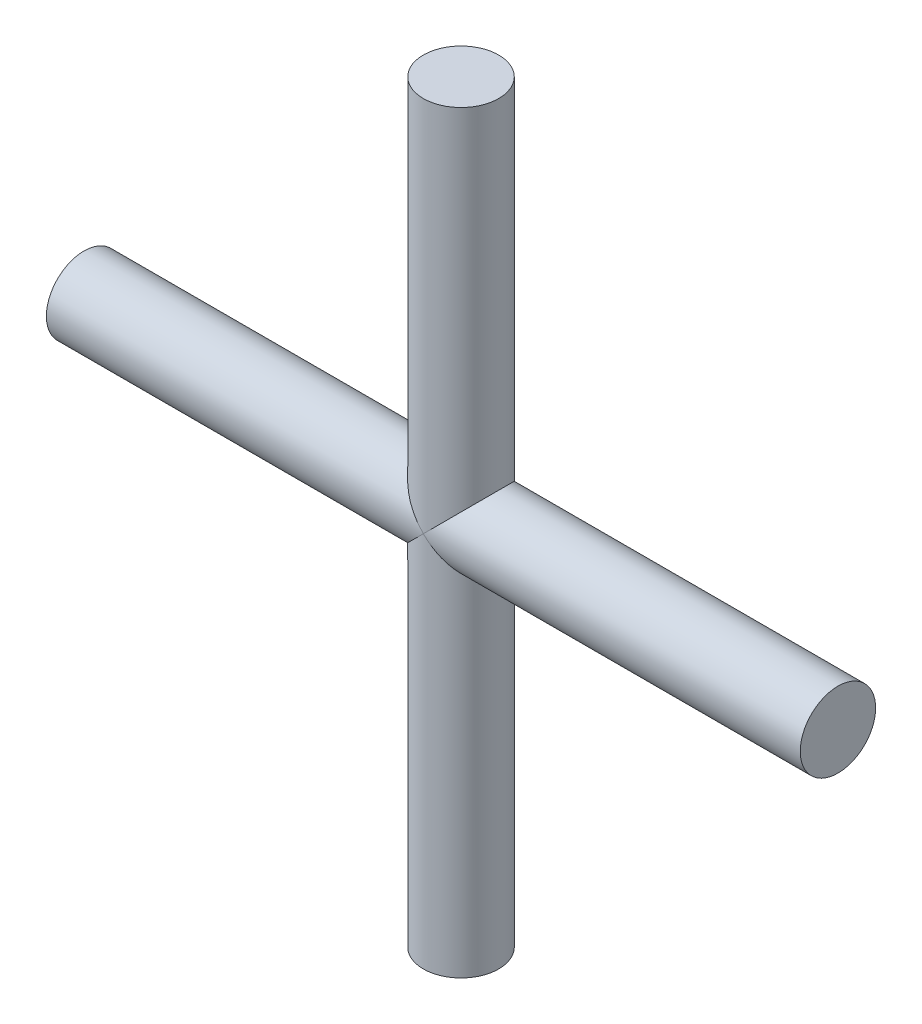
ISO-10303-21;
HEADER;
FILE_DESCRIPTION(('STEP AP214'),'2;1');
FILE_NAME('part.step','',(''),(''),'','','');
FILE_SCHEMA(('AUTOMOTIVE_DESIGN { 1 0 10303 214 1 1 1 1 }'));
ENDSEC;
DATA;
#1=APPLICATION_CONTEXT('core data for automotive mechanical design processes');
#2=APPLICATION_PROTOCOL_DEFINITION('international standard','automotive_design',2000,#1);
#3=PRODUCT_CONTEXT('',#1,'mechanical');
#4=PRODUCT('Part','Part','',(#3));
#5=PRODUCT_RELATED_PRODUCT_CATEGORY('part','',(#4));
#6=PRODUCT_DEFINITION_FORMATION('','',#4);
#7=PRODUCT_DEFINITION_CONTEXT('part definition',#1,'design');
#8=PRODUCT_DEFINITION('design','',#6,#7);
#9=PRODUCT_DEFINITION_SHAPE('','',#8);
#10=(LENGTH_UNIT() NAMED_UNIT(*) SI_UNIT(.MILLI.,.METRE.));
#11=(NAMED_UNIT(*) PLANE_ANGLE_UNIT() SI_UNIT($,.RADIAN.));
#12=(NAMED_UNIT(*) SI_UNIT($,.STERADIAN.) SOLID_ANGLE_UNIT());
#13=UNCERTAINTY_MEASURE_WITH_UNIT(LENGTH_MEASURE(1.E-05),#10,'distance_accuracy_value','');
#14=(GEOMETRIC_REPRESENTATION_CONTEXT(3) GLOBAL_UNCERTAINTY_ASSIGNED_CONTEXT((#13)) GLOBAL_UNIT_ASSIGNED_CONTEXT((#10,
#11,#12)) REPRESENTATION_CONTEXT('',''));
#15=CARTESIAN_POINT('',(0.,0.,0.));
#16=DIRECTION('',(0.,0.,1.));
#17=DIRECTION('',(1.,0.,0.));
#18=AXIS2_PLACEMENT_3D('',#15,#16,#17);
#19=CARTESIAN_POINT('',(0.,15.,0.));
#20=DIRECTION('',(0.,-1.,0.));
#21=DIRECTION('',(0.,0.,-1.));
#22=AXIS2_PLACEMENT_3D('',#19,#20,#21);
#23=CYLINDRICAL_SURFACE('',#22,0.75);
#24=CARTESIAN_POINT('',(0.,15.,0.));
#25=DIRECTION('',(0.,1.,0.));
#26=DIRECTION('',(0.,0.,1.));
#27=AXIS2_PLACEMENT_3D('',#24,#25,#26);
#28=CIRCLE('',#27,0.75);
#29=CARTESIAN_POINT('',(0.,15.,0.75));
#30=VERTEX_POINT('',#29);
#31=EDGE_CURVE('E72',#30,#30,#28,.T.);
#32=ORIENTED_EDGE('',*,*,#31,.F.);
#33=EDGE_LOOP('',(#32));
#34=FACE_BOUND('',#33,.T.);
#35=CARTESIAN_POINT('',(0.,7.5,0.));
#36=DIRECTION('',(-0.707106781186547,-0.707106781186548,0.));
#37=DIRECTION('',(0.707106781186548,-0.707106781186547,0.));
#38=AXIS2_PLACEMENT_3D('',#35,#36,#37);
#39=ELLIPSE('',#38,1.06066017177982,0.75);
#40=CARTESIAN_POINT('',(0.,7.5,0.75));
#41=VERTEX_POINT('',#40);
#42=CARTESIAN_POINT('',(0.,7.5,-0.75));
#43=VERTEX_POINT('',#42);
#44=EDGE_CURVE('E54',#41,#43,#39,.T.);
#45=ORIENTED_EDGE('',*,*,#44,.F.);
#46=CARTESIAN_POINT('',(0.,7.5,0.));
#47=DIRECTION('',(0.707106781186548,-0.707106781186547,0.));
#48=DIRECTION('',(-0.707106781186547,-0.707106781186548,0.));
#49=AXIS2_PLACEMENT_3D('',#46,#47,#48);
#50=ELLIPSE('',#49,1.06066017177982,0.75);
#51=EDGE_CURVE('E66',#43,#41,#50,.T.);
#52=ORIENTED_EDGE('',*,*,#51,.F.);
#53=EDGE_LOOP('',(#45,#52));
#54=FACE_BOUND('',#53,.T.);
#55=ADVANCED_FACE('F45',(#34,#54),#23,.T.);
#56=CARTESIAN_POINT('',(0.,15.,0.));
#57=DIRECTION('',(0.,1.,0.));
#58=DIRECTION('',(0.,0.,1.));
#59=AXIS2_PLACEMENT_3D('',#56,#57,#58);
#60=PLANE('',#59);
#61=ORIENTED_EDGE('',*,*,#31,.T.);
#62=EDGE_LOOP('',(#61));
#63=FACE_BOUND('',#62,.T.);
#64=ADVANCED_FACE('F96',(#63),#60,.T.);
#65=CARTESIAN_POINT('',(-7.5,7.5,0.));
#66=DIRECTION('',(1.,0.,0.));
#67=DIRECTION('',(0.,1.,0.));
#68=AXIS2_PLACEMENT_3D('',#65,#66,#67);
#69=PLANE('',#68);
#70=CARTESIAN_POINT('',(-7.5,7.5,0.));
#71=DIRECTION('',(1.,0.,0.));
#72=DIRECTION('',(0.,1.,0.));
#73=AXIS2_PLACEMENT_3D('',#70,#71,#72);
#74=CIRCLE('',#73,0.75);
#75=CARTESIAN_POINT('',(-7.5,8.25,0.));
#76=VERTEX_POINT('',#75);
#77=EDGE_CURVE('E114',#76,#76,#74,.T.);
#78=ORIENTED_EDGE('',*,*,#77,.F.);
#79=EDGE_LOOP('',(#78));
#80=FACE_BOUND('',#79,.T.);
#81=ADVANCED_FACE('F93',(#80),#69,.F.);
#82=CARTESIAN_POINT('',(7.5,7.5,0.));
#83=DIRECTION('',(-1.,0.,0.));
#84=DIRECTION('',(0.,-1.,0.));
#85=AXIS2_PLACEMENT_3D('',#82,#83,#84);
#86=CYLINDRICAL_SURFACE('',#85,0.75);
#87=ORIENTED_EDGE('',*,*,#77,.T.);
#88=EDGE_LOOP('',(#87));
#89=FACE_BOUND('',#88,.T.);
#90=CARTESIAN_POINT('',(0.,7.5,0.));
#91=DIRECTION('',(0.707106781186548,-0.707106781186547,0.));
#92=DIRECTION('',(-0.707106781186547,-0.707106781186548,0.));
#93=AXIS2_PLACEMENT_3D('',#90,#91,#92);
#94=ELLIPSE('',#93,1.06066017177982,0.75);
#95=EDGE_CURVE('E60',#43,#41,#94,.F.);
#96=ORIENTED_EDGE('',*,*,#95,.T.);
#97=ORIENTED_EDGE('',*,*,#44,.T.);
#98=EDGE_LOOP('',(#96,#97));
#99=FACE_BOUND('',#98,.T.);
#100=ADVANCED_FACE('F74',(#89,#99),#86,.T.);
#101=CARTESIAN_POINT('',(0.,0.,0.));
#102=DIRECTION('',(0.,1.,0.));
#103=DIRECTION('',(0.,0.,1.));
#104=AXIS2_PLACEMENT_3D('',#101,#102,#103);
#105=PLANE('',#104);
#106=CARTESIAN_POINT('',(0.,0.,0.));
#107=DIRECTION('',(0.,1.,0.));
#108=DIRECTION('',(0.,0.,1.));
#109=AXIS2_PLACEMENT_3D('',#106,#107,#108);
#110=CIRCLE('',#109,0.75);
#111=CARTESIAN_POINT('',(0.,0.,0.75));
#112=VERTEX_POINT('',#111);
#113=EDGE_CURVE('E107',#112,#112,#110,.T.);
#114=ORIENTED_EDGE('',*,*,#113,.F.);
#115=EDGE_LOOP('',(#114));
#116=FACE_BOUND('',#115,.T.);
#117=ADVANCED_FACE('F87',(#116),#105,.F.);
#118=ORIENTED_EDGE('',*,*,#113,.T.);
#119=EDGE_LOOP('',(#118));
#120=FACE_BOUND('',#119,.T.);
#121=CARTESIAN_POINT('',(0.,7.5,0.));
#122=DIRECTION('',(-0.707106781186547,-0.707106781186548,0.));
#123=DIRECTION('',(0.707106781186548,-0.707106781186547,0.));
#124=AXIS2_PLACEMENT_3D('',#121,#122,#123);
#125=ELLIPSE('',#124,1.06066017177982,0.75);
#126=EDGE_CURVE('E11',#41,#43,#125,.F.);
#127=ORIENTED_EDGE('',*,*,#126,.F.);
#128=ORIENTED_EDGE('',*,*,#95,.F.);
#129=EDGE_LOOP('',(#127,#128));
#130=FACE_BOUND('',#129,.T.);
#131=ADVANCED_FACE('F47',(#120,#130),#23,.T.);
#132=CARTESIAN_POINT('',(7.5,7.5,0.));
#133=DIRECTION('',(1.,0.,0.));
#134=DIRECTION('',(0.,1.,0.));
#135=AXIS2_PLACEMENT_3D('',#132,#133,#134);
#136=CIRCLE('',#135,0.75);
#137=CARTESIAN_POINT('',(7.5,8.25,0.));
#138=VERTEX_POINT('',#137);
#139=EDGE_CURVE('E111',#138,#138,#136,.T.);
#140=ORIENTED_EDGE('',*,*,#139,.F.);
#141=EDGE_LOOP('',(#140));
#142=FACE_BOUND('',#141,.T.);
#143=ORIENTED_EDGE('',*,*,#51,.T.);
#144=ORIENTED_EDGE('',*,*,#126,.T.);
#145=EDGE_LOOP('',(#143,#144));
#146=FACE_BOUND('',#145,.T.);
#147=ADVANCED_FACE('F76',(#142,#146),#86,.T.);
#148=CARTESIAN_POINT('',(7.5,7.5,0.));
#149=DIRECTION('',(1.,0.,0.));
#150=DIRECTION('',(0.,1.,0.));
#151=AXIS2_PLACEMENT_3D('',#148,#149,#150);
#152=PLANE('',#151);
#153=ORIENTED_EDGE('',*,*,#139,.T.);
#154=EDGE_LOOP('',(#153));
#155=FACE_BOUND('',#154,.T.);
#156=ADVANCED_FACE('F78',(#155),#152,.T.);
#157=CLOSED_SHELL('',(#55,#64,#81,#100,#117,#131,#147,#156));
#158=MANIFOLD_SOLID_BREP('B2',#157);
#159=ADVANCED_BREP_SHAPE_REPRESENTATION('',(#18,#158),#14);
#160=SHAPE_DEFINITION_REPRESENTATION(#9,#159);
ENDSEC;
END-ISO-10303-21;
